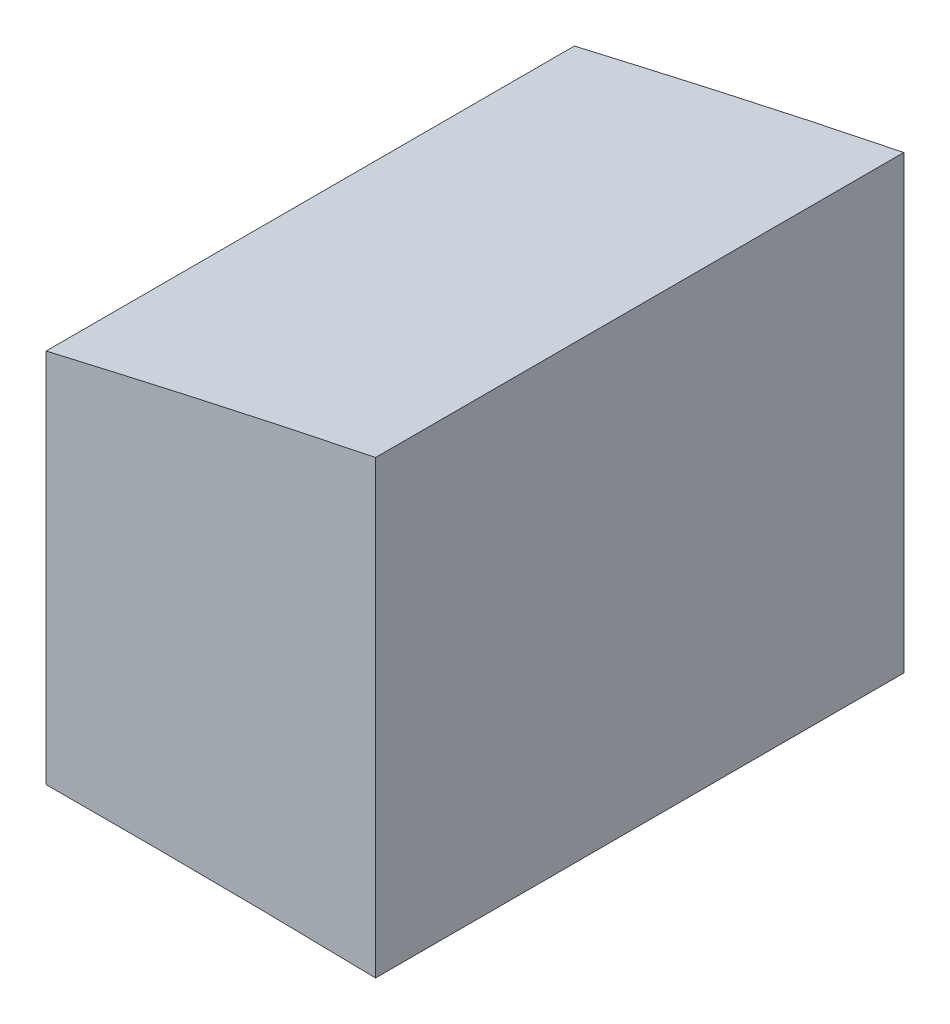
ISO-10303-21;
HEADER;
FILE_DESCRIPTION(('STEP AP214'),'2;1');
FILE_NAME('part.step','',(''),(''),'','','');
FILE_SCHEMA(('AUTOMOTIVE_DESIGN { 1 0 10303 214 1 1 1 1 }'));
ENDSEC;
DATA;
#1=APPLICATION_CONTEXT('core data for automotive mechanical design processes');
#2=APPLICATION_PROTOCOL_DEFINITION('international standard','automotive_design',2000,#1);
#3=PRODUCT_CONTEXT('',#1,'mechanical');
#4=PRODUCT('Part','Part','',(#3));
#5=PRODUCT_RELATED_PRODUCT_CATEGORY('part','',(#4));
#6=PRODUCT_DEFINITION_FORMATION('','',#4);
#7=PRODUCT_DEFINITION_CONTEXT('part definition',#1,'design');
#8=PRODUCT_DEFINITION('design','',#6,#7);
#9=PRODUCT_DEFINITION_SHAPE('','',#8);
#10=(LENGTH_UNIT() NAMED_UNIT(*) SI_UNIT(.MILLI.,.METRE.));
#11=(NAMED_UNIT(*) PLANE_ANGLE_UNIT() SI_UNIT($,.RADIAN.));
#12=(NAMED_UNIT(*) SI_UNIT($,.STERADIAN.) SOLID_ANGLE_UNIT());
#13=UNCERTAINTY_MEASURE_WITH_UNIT(LENGTH_MEASURE(1.E-05),#10,'distance_accuracy_value','');
#14=(GEOMETRIC_REPRESENTATION_CONTEXT(3) GLOBAL_UNCERTAINTY_ASSIGNED_CONTEXT((#13)) GLOBAL_UNIT_ASSIGNED_CONTEXT((#10,
#11,#12)) REPRESENTATION_CONTEXT('',''));
#15=CARTESIAN_POINT('',(0.,0.,0.));
#16=DIRECTION('',(0.,0.,1.));
#17=DIRECTION('',(1.,0.,0.));
#18=AXIS2_PLACEMENT_3D('',#15,#16,#17);
#19=CARTESIAN_POINT('',(6.23690674710793,-9.83282120050422,28.956));
#20=DIRECTION('',(0.,0.,1.));
#21=DIRECTION('',(1.,0.,0.));
#22=AXIS2_PLACEMENT_3D('',#19,#20,#21);
#23=PLANE('',#22);
#24=DIRECTION('',(0.,-1.,0.));
#25=VECTOR('',#24,1.);
#26=CARTESIAN_POINT('',(-47.9510549303898,30.6925003680842,28.956));
#27=LINE('',#26,#25);
#28=CARTESIAN_POINT('',(-47.9510549303898,18.9247222411647,28.956));
#29=VERTEX_POINT('',#28);
#30=CARTESIAN_POINT('',(-47.9510549303898,-5.78451429799937,28.956));
#31=VERTEX_POINT('',#30);
#32=EDGE_CURVE('E187',#29,#31,#27,.T.);
#33=ORIENTED_EDGE('',*,*,#32,.F.);
#34=CARTESIAN_POINT('',(76.2169962626333,-12.3082935907539,28.956));
#35=CARTESIAN_POINT('',(75.6069525390447,-6.76655965764841,28.956));
#36=CARTESIAN_POINT('',(69.7043006889504,1.13838920453428,28.956));
#37=CARTESIAN_POINT('',(56.4222366314094,10.2643835983855,28.956));
#38=CARTESIAN_POINT('',(36.9761031047391,19.3707728361886,28.956));
#39=CARTESIAN_POINT('',(8.74168720896823,24.8154039567916,28.956));
#40=CARTESIAN_POINT('',(-27.455234983126,23.566672909106,28.956));
#41=CARTESIAN_POINT('',(-52.387628687855,18.1036316509052,28.956));
#42=CARTESIAN_POINT('',(-66.0069716290183,14.9523239686121,28.956));
#43=B_SPLINE_CURVE_WITH_KNOTS('',3,(#34,#35,#36,#37,#38,#39,#40,#41,#42),.UNSPECIFIED.,.F.,.F.,
(4,1,1,1,1,1,4),(0.,0.0865869930935198,0.16173742787457,0.268322265449627,0.445156626621206,
0.638028872876503,0.87237087622276),.UNSPECIFIED.);
#44=CARTESIAN_POINT('',(-66.0069716290183,14.9523239686121,28.956));
#45=VERTEX_POINT('',#44);
#46=EDGE_CURVE('E119',#29,#45,#43,.T.);
#47=ORIENTED_EDGE('',*,*,#46,.T.);
#48=DIRECTION('',(0.,-1.,0.));
#49=VECTOR('',#48,1.);
#50=CARTESIAN_POINT('',(-66.0069716290183,14.9523239686121,28.956));
#51=LINE('',#50,#49);
#52=CARTESIAN_POINT('',(-66.0069716290183,-5.63470862311888,28.956));
#53=VERTEX_POINT('',#52);
#54=EDGE_CURVE('E64',#45,#53,#51,.T.);
#55=ORIENTED_EDGE('',*,*,#54,.T.);
#56=CARTESIAN_POINT('',(-66.0069716290183,-5.63470862311887,28.956));
#57=CARTESIAN_POINT('',(-44.5940371879975,-5.53917687984291,28.956));
#58=CARTESIAN_POINT('',(-13.0130223079607,-6.72409850193042,28.956));
#59=CARTESIAN_POINT('',(26.1366565690305,-12.7508567541694,28.956));
#60=CARTESIAN_POINT('',(48.7652674229662,-16.9007642038902,28.956));
#61=CARTESIAN_POINT('',(64.6833626627234,-16.9690523934929,28.956));
#62=CARTESIAN_POINT('',(75.2906304926915,-17.5225292184952,28.956));
#63=CARTESIAN_POINT('',(76.2169962626333,-12.3082935907539,28.956));
#64=B_SPLINE_CURVE_WITH_KNOTS('',3,(#56,#57,#58,#59,#60,#61,#62,#63),.UNSPECIFIED.,.F.,.F.,(4,1,
1,1,1,4),(0.133250971952972,0.517329721776624,0.696666541434988,0.84940993817877,
0.919519723249622,1.),.UNSPECIFIED.);
#65=EDGE_CURVE('E87',#53,#31,#64,.T.);
#66=ORIENTED_EDGE('',*,*,#65,.T.);
#67=EDGE_LOOP('',(#33,#47,#55,#66));
#68=FACE_BOUND('',#67,.T.);
#69=ADVANCED_FACE('F39',(#68),#23,.T.);
#70=CARTESIAN_POINT('',(6.23690674710793,-9.83282120050422,0.));
#71=DIRECTION('',(0.,0.,1.));
#72=DIRECTION('',(1.,0.,0.));
#73=AXIS2_PLACEMENT_3D('',#70,#71,#72);
#74=PLANE('',#73);
#75=CARTESIAN_POINT('',(76.2169962626333,-12.3082935907539,0.));
#76=CARTESIAN_POINT('',(75.6069525390447,-6.76655965764841,0.));
#77=CARTESIAN_POINT('',(69.7043006889504,1.13838920453428,0.));
#78=CARTESIAN_POINT('',(56.4222366314094,10.2643835983855,0.));
#79=CARTESIAN_POINT('',(36.9761031047391,19.3707728361886,0.));
#80=CARTESIAN_POINT('',(8.74168720896823,24.8154039567916,0.));
#81=CARTESIAN_POINT('',(-27.455234983126,23.566672909106,0.));
#82=CARTESIAN_POINT('',(-52.387628687855,18.1036316509052,0.));
#83=CARTESIAN_POINT('',(-66.0069716290183,14.9523239686121,0.));
#84=B_SPLINE_CURVE_WITH_KNOTS('',3,(#75,#76,#77,#78,#79,#80,#81,#82,#83),.UNSPECIFIED.,.F.,.F.,
(4,1,1,1,1,1,4),(0.,0.0865869930935198,0.16173742787457,0.268322265449627,0.445156626621206,
0.638028872876503,0.87237087622276),.UNSPECIFIED.);
#85=CARTESIAN_POINT('',(-47.9510549397014,18.9247222411647,0.));
#86=VERTEX_POINT('',#85);
#87=CARTESIAN_POINT('',(-66.0069716290183,14.9523239686121,0.));
#88=VERTEX_POINT('',#87);
#89=EDGE_CURVE('E88',#86,#88,#84,.T.);
#90=ORIENTED_EDGE('',*,*,#89,.F.);
#91=DIRECTION('',(0.,-1.,0.));
#92=VECTOR('',#91,1.);
#93=CARTESIAN_POINT('',(-47.9510549303898,30.6925003680842,0.));
#94=LINE('',#93,#92);
#95=CARTESIAN_POINT('',(-47.9510549303898,-5.78451429799937,0.));
#96=VERTEX_POINT('',#95);
#97=EDGE_CURVE('E56',#86,#96,#94,.T.);
#98=ORIENTED_EDGE('',*,*,#97,.T.);
#99=CARTESIAN_POINT('',(-66.0069716290183,-5.63470862311887,0.));
#100=CARTESIAN_POINT('',(-44.5940371879975,-5.53917687984291,0.));
#101=CARTESIAN_POINT('',(-13.0130223079607,-6.72409850193042,0.));
#102=CARTESIAN_POINT('',(26.1366565690305,-12.7508567541694,0.));
#103=CARTESIAN_POINT('',(48.7652674229662,-16.9007642038902,0.));
#104=CARTESIAN_POINT('',(64.6833626627234,-16.9690523934929,0.));
#105=CARTESIAN_POINT('',(75.2906304926915,-17.5225292184952,0.));
#106=CARTESIAN_POINT('',(76.2169962626333,-12.3082935907539,0.));
#107=B_SPLINE_CURVE_WITH_KNOTS('',3,(#99,#100,#101,#102,#103,#104,#105,#106),.UNSPECIFIED.,.F.,
.F.,(4,1,1,1,1,4),(0.133250971952972,0.517329721776624,0.696666541434988,0.84940993817877,
0.919519723249622,1.),.UNSPECIFIED.);
#108=CARTESIAN_POINT('',(-66.0069716290183,-5.63470862311888,0.));
#109=VERTEX_POINT('',#108);
#110=EDGE_CURVE('E93',#109,#96,#107,.T.);
#111=ORIENTED_EDGE('',*,*,#110,.F.);
#112=DIRECTION('',(0.,-1.,0.));
#113=VECTOR('',#112,1.);
#114=CARTESIAN_POINT('',(-66.0069716290183,14.9523239686121,0.));
#115=LINE('',#114,#113);
#116=EDGE_CURVE('E77',#88,#109,#115,.T.);
#117=ORIENTED_EDGE('',*,*,#116,.F.);
#118=EDGE_LOOP('',(#90,#98,#111,#117));
#119=FACE_BOUND('',#118,.T.);
#120=ADVANCED_FACE('F96',(#119),#74,.F.);
#121=DIRECTION('',(0.,0.,-1.));
#122=VECTOR('',#121,1.);
#123=SURFACE_OF_LINEAR_EXTRUSION('',#64,#122);
#124=ORIENTED_EDGE('',*,*,#110,.T.);
#125=DIRECTION('',(0.,0.,-1.));
#126=VECTOR('',#125,1.);
#127=CARTESIAN_POINT('',(-47.9510549303897,-5.7845142978359,28.956));
#128=LINE('',#127,#126);
#129=EDGE_CURVE('E98',#96,#31,#128,.F.);
#130=ORIENTED_EDGE('',*,*,#129,.T.);
#131=ORIENTED_EDGE('',*,*,#65,.F.);
#132=DIRECTION('',(0.,0.,-1.));
#133=VECTOR('',#132,1.);
#134=CARTESIAN_POINT('',(-66.0069716290183,-5.63470862311888,28.956));
#135=LINE('',#134,#133);
#136=EDGE_CURVE('E80',#53,#109,#135,.T.);
#137=ORIENTED_EDGE('',*,*,#136,.T.);
#138=EDGE_LOOP('',(#124,#130,#131,#137));
#139=FACE_BOUND('',#138,.T.);
#140=ADVANCED_FACE('F41',(#139),#123,.F.);
#141=DIRECTION('',(0.,0.,-1.));
#142=VECTOR('',#141,1.);
#143=SURFACE_OF_LINEAR_EXTRUSION('',#43,#142);
#144=ORIENTED_EDGE('',*,*,#46,.F.);
#145=DIRECTION('',(0.,0.,-1.));
#146=VECTOR('',#145,1.);
#147=CARTESIAN_POINT('',(-47.9510549303898,18.9247222430527,28.956));
#148=LINE('',#147,#146);
#149=EDGE_CURVE('E11',#29,#86,#148,.T.);
#150=ORIENTED_EDGE('',*,*,#149,.T.);
#151=ORIENTED_EDGE('',*,*,#89,.T.);
#152=DIRECTION('',(0.,0.,-1.));
#153=VECTOR('',#152,1.);
#154=CARTESIAN_POINT('',(-66.0069716290183,14.9523239686121,28.956));
#155=LINE('',#154,#153);
#156=EDGE_CURVE('E49',#45,#88,#155,.T.);
#157=ORIENTED_EDGE('',*,*,#156,.F.);
#158=EDGE_LOOP('',(#144,#150,#151,#157));
#159=FACE_BOUND('',#158,.T.);
#160=ADVANCED_FACE('F136',(#159),#143,.F.);
#161=CARTESIAN_POINT('',(-66.0069716290183,14.9523239686121,28.956));
#162=DIRECTION('',(1.,0.,0.));
#163=DIRECTION('',(0.,1.,0.));
#164=AXIS2_PLACEMENT_3D('',#161,#162,#163);
#165=PLANE('',#164);
#166=ORIENTED_EDGE('',*,*,#116,.T.);
#167=ORIENTED_EDGE('',*,*,#136,.F.);
#168=ORIENTED_EDGE('',*,*,#54,.F.);
#169=ORIENTED_EDGE('',*,*,#156,.T.);
#170=EDGE_LOOP('',(#166,#167,#168,#169));
#171=FACE_BOUND('',#170,.T.);
#172=ADVANCED_FACE('F79',(#171),#165,.F.);
#173=CARTESIAN_POINT('',(-47.9510549303898,30.6925003680842,0.));
#174=DIRECTION('',(-1.,0.,0.));
#175=DIRECTION('',(0.,-1.,0.));
#176=AXIS2_PLACEMENT_3D('',#173,#174,#175);
#177=PLANE('',#176);
#178=ORIENTED_EDGE('',*,*,#97,.F.);
#179=ORIENTED_EDGE('',*,*,#149,.F.);
#180=ORIENTED_EDGE('',*,*,#32,.T.);
#181=ORIENTED_EDGE('',*,*,#129,.F.);
#182=EDGE_LOOP('',(#178,#179,#180,#181));
#183=FACE_BOUND('',#182,.T.);
#184=ADVANCED_FACE('F142',(#183),#177,.F.);
#185=CLOSED_SHELL('',(#69,#120,#140,#160,#172,#184));
#186=MANIFOLD_SOLID_BREP('B2',#185);
#187=ADVANCED_BREP_SHAPE_REPRESENTATION('',(#18,#186),#14);
#188=SHAPE_DEFINITION_REPRESENTATION(#9,#187);
ENDSEC;
END-ISO-10303-21;
